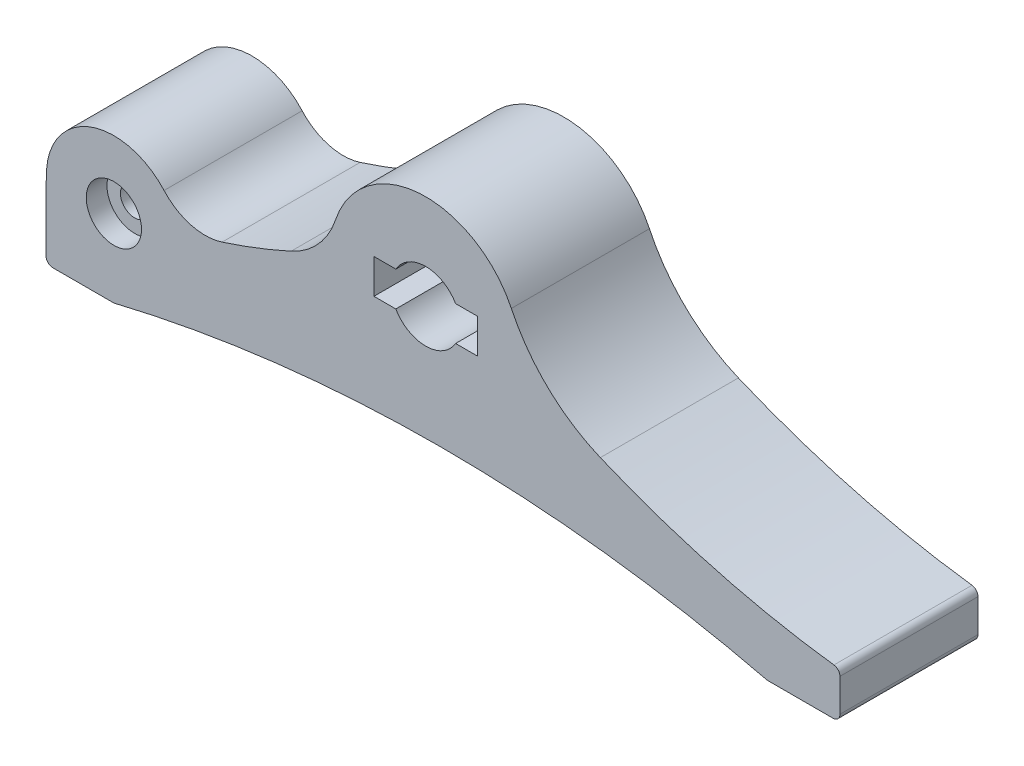
ISO-10303-21;
HEADER;
FILE_DESCRIPTION(('STEP AP214'),'2;1');
FILE_NAME('part.step','',(''),(''),'','','');
FILE_SCHEMA(('AUTOMOTIVE_DESIGN { 1 0 10303 214 1 1 1 1 }'));
ENDSEC;
DATA;
#1=APPLICATION_CONTEXT('core data for automotive mechanical design processes');
#2=APPLICATION_PROTOCOL_DEFINITION('international standard','automotive_design',2000,#1);
#3=PRODUCT_CONTEXT('',#1,'mechanical');
#4=PRODUCT('Part','Part','',(#3));
#5=PRODUCT_RELATED_PRODUCT_CATEGORY('part','',(#4));
#6=PRODUCT_DEFINITION_FORMATION('','',#4);
#7=PRODUCT_DEFINITION_CONTEXT('part definition',#1,'design');
#8=PRODUCT_DEFINITION('design','',#6,#7);
#9=PRODUCT_DEFINITION_SHAPE('','',#8);
#10=(LENGTH_UNIT() NAMED_UNIT(*) SI_UNIT(.MILLI.,.METRE.));
#11=(NAMED_UNIT(*) PLANE_ANGLE_UNIT() SI_UNIT($,.RADIAN.));
#12=(NAMED_UNIT(*) SI_UNIT($,.STERADIAN.) SOLID_ANGLE_UNIT());
#13=UNCERTAINTY_MEASURE_WITH_UNIT(LENGTH_MEASURE(1.E-05),#10,'distance_accuracy_value','');
#14=(GEOMETRIC_REPRESENTATION_CONTEXT(3) GLOBAL_UNCERTAINTY_ASSIGNED_CONTEXT((#13)) GLOBAL_UNIT_ASSIGNED_CONTEXT((#10,
#11,#12)) REPRESENTATION_CONTEXT('',''));
#15=CARTESIAN_POINT('',(0.,0.,0.));
#16=DIRECTION('',(0.,0.,1.));
#17=DIRECTION('',(1.,0.,0.));
#18=AXIS2_PLACEMENT_3D('',#15,#16,#17);
#19=CARTESIAN_POINT('',(-45.1700457196241,-10.9429497954306,20.));
#20=DIRECTION('',(0.,0.,-1.));
#21=DIRECTION('',(-1.,0.,0.));
#22=AXIS2_PLACEMENT_3D('',#19,#20,#21);
#23=CYLINDRICAL_SURFACE('',#22,2.04999999999999);
#24=CARTESIAN_POINT('',(-45.1700457196241,-10.9429497954306,3.));
#25=DIRECTION('',(0.,0.,-1.));
#26=DIRECTION('',(-1.,0.,0.));
#27=AXIS2_PLACEMENT_3D('',#24,#25,#26);
#28=CIRCLE('',#27,2.04999999999999);
#29=CARTESIAN_POINT('',(-47.2200457196241,-10.9429497954306,3.));
#30=VERTEX_POINT('',#29);
#31=EDGE_CURVE('E272',#30,#30,#28,.T.);
#32=ORIENTED_EDGE('',*,*,#31,.T.);
#33=EDGE_LOOP('',(#32));
#34=FACE_BOUND('',#33,.T.);
#35=CARTESIAN_POINT('',(-45.1700457196241,-10.9429497954306,17.));
#36=DIRECTION('',(0.,0.,1.));
#37=DIRECTION('',(1.,0.,0.));
#38=AXIS2_PLACEMENT_3D('',#35,#36,#37);
#39=CIRCLE('',#38,2.04999999999999);
#40=CARTESIAN_POINT('',(-43.1200457196241,-10.9429497954306,17.));
#41=VERTEX_POINT('',#40);
#42=EDGE_CURVE('E42',#41,#41,#39,.T.);
#43=ORIENTED_EDGE('',*,*,#42,.T.);
#44=EDGE_LOOP('',(#43));
#45=FACE_BOUND('',#44,.T.);
#46=ADVANCED_FACE('F38',(#34,#45),#23,.F.);
#47=CARTESIAN_POINT('',(0.,0.,20.));
#48=DIRECTION('',(0.,0.,-1.));
#49=DIRECTION('',(-1.,0.,0.));
#50=AXIS2_PLACEMENT_3D('',#47,#48,#49);
#51=CYLINDRICAL_SURFACE('',#50,13.7521875573783);
#52=CARTESIAN_POINT('',(0.,0.,20.));
#53=DIRECTION('',(0.,0.,1.));
#54=DIRECTION('',(1.,0.,0.));
#55=AXIS2_PLACEMENT_3D('',#52,#53,#54);
#56=CIRCLE('',#55,13.7521875573783);
#57=CARTESIAN_POINT('',(12.4069676906403,5.93210041525924,20.));
#58=VERTEX_POINT('',#57);
#59=CARTESIAN_POINT('',(-13.0560873283206,4.31986646652155,20.));
#60=VERTEX_POINT('',#59);
#61=EDGE_CURVE('E244',#58,#60,#56,.T.);
#62=ORIENTED_EDGE('',*,*,#61,.F.);
#63=DIRECTION('',(0.,0.,-1.));
#64=VECTOR('',#63,1.);
#65=CARTESIAN_POINT('',(12.4069676906403,5.93210041525924,20.));
#66=LINE('',#65,#64);
#67=CARTESIAN_POINT('',(12.4069676906403,5.93210041525924,0.));
#68=VERTEX_POINT('',#67);
#69=EDGE_CURVE('E380',#58,#68,#66,.T.);
#70=ORIENTED_EDGE('',*,*,#69,.T.);
#71=CARTESIAN_POINT('',(0.,0.,0.));
#72=DIRECTION('',(0.,0.,1.));
#73=DIRECTION('',(1.,0.,0.));
#74=AXIS2_PLACEMENT_3D('',#71,#72,#73);
#75=CIRCLE('',#74,13.7521875573783);
#76=CARTESIAN_POINT('',(-13.0560873283206,4.31986646652155,0.));
#77=VERTEX_POINT('',#76);
#78=EDGE_CURVE('E288',#68,#77,#75,.T.);
#79=ORIENTED_EDGE('',*,*,#78,.T.);
#80=DIRECTION('',(0.,0.,-1.));
#81=VECTOR('',#80,1.);
#82=CARTESIAN_POINT('',(-13.0560873283206,4.31986646652155,20.));
#83=LINE('',#82,#81);
#84=EDGE_CURVE('E335',#77,#60,#83,.F.);
#85=ORIENTED_EDGE('',*,*,#84,.T.);
#86=EDGE_LOOP('',(#62,#70,#79,#85));
#87=FACE_BOUND('',#86,.T.);
#88=ADVANCED_FACE('F439',(#87),#51,.T.);
#89=CARTESIAN_POINT('',(-58.2787027432777,82.7966281239389,20.));
#90=DIRECTION('',(0.,0.,-1.));
#91=DIRECTION('',(-1.,0.,0.));
#92=AXIS2_PLACEMENT_3D('',#89,#90,#91);
#93=CYLINDRICAL_SURFACE('',#92,94.0100642659815);
#94=CARTESIAN_POINT('',(-58.2787027432777,82.7966281239389,0.));
#95=DIRECTION('',(0.,0.,1.));
#96=DIRECTION('',(1.,0.,0.));
#97=AXIS2_PLACEMENT_3D('',#94,#95,#96);
#98=CIRCLE('',#97,94.0100642659815);
#99=CARTESIAN_POINT('',(-19.4985505803734,-2.84210132434254,0.));
#100=VERTEX_POINT('',#99);
#101=CARTESIAN_POINT('',(-29.4918320171861,-6.69755189405587,0.));
#102=VERTEX_POINT('',#101);
#103=EDGE_CURVE('E290',#100,#102,#98,.F.);
#104=ORIENTED_EDGE('',*,*,#103,.T.);
#105=DIRECTION('',(0.,0.,-1.));
#106=VECTOR('',#105,1.);
#107=CARTESIAN_POINT('',(-29.4918320171861,-6.69755189405588,20.));
#108=LINE('',#107,#106);
#109=CARTESIAN_POINT('',(-29.4918320171861,-6.69755189405587,20.));
#110=VERTEX_POINT('',#109);
#111=EDGE_CURVE('E346',#102,#110,#108,.F.);
#112=ORIENTED_EDGE('',*,*,#111,.T.);
#113=CARTESIAN_POINT('',(-58.2787027432777,82.7966281239389,20.));
#114=DIRECTION('',(0.,0.,1.));
#115=DIRECTION('',(1.,0.,0.));
#116=AXIS2_PLACEMENT_3D('',#113,#114,#115);
#117=CIRCLE('',#116,94.0100642659815);
#118=CARTESIAN_POINT('',(-19.4985505803734,-2.84210132434254,20.));
#119=VERTEX_POINT('',#118);
#120=EDGE_CURVE('E246',#119,#110,#117,.F.);
#121=ORIENTED_EDGE('',*,*,#120,.F.);
#122=DIRECTION('',(0.,0.,-1.));
#123=VECTOR('',#122,1.);
#124=CARTESIAN_POINT('',(-19.4985505803734,-2.84210132434257,20.));
#125=LINE('',#124,#123);
#126=EDGE_CURVE('E320',#119,#100,#125,.T.);
#127=ORIENTED_EDGE('',*,*,#126,.T.);
#128=EDGE_LOOP('',(#104,#112,#121,#127));
#129=FACE_BOUND('',#128,.T.);
#130=ADVANCED_FACE('F444',(#129),#93,.F.);
#131=CARTESIAN_POINT('',(-45.1700457196241,-10.9429497954306,20.));
#132=DIRECTION('',(0.,0.,-1.));
#133=DIRECTION('',(-1.,0.,0.));
#134=AXIS2_PLACEMENT_3D('',#131,#132,#133);
#135=CYLINDRICAL_SURFACE('',#134,9.76738269673384);
#136=CARTESIAN_POINT('',(-45.1700457196241,-10.9429497954306,20.));
#137=DIRECTION('',(0.,0.,1.));
#138=DIRECTION('',(1.,0.,0.));
#139=AXIS2_PLACEMENT_3D('',#136,#137,#138);
#140=CIRCLE('',#139,9.76738269673384);
#141=CARTESIAN_POINT('',(-37.8978372739602,-4.42246292194724,20.));
#142=VERTEX_POINT('',#141);
#143=CARTESIAN_POINT('',(-54.9192478656385,-11.5386193855598,20.));
#144=VERTEX_POINT('',#143);
#145=EDGE_CURVE('E249',#142,#144,#140,.T.);
#146=ORIENTED_EDGE('',*,*,#145,.F.);
#147=DIRECTION('',(0.,0.,-1.));
#148=VECTOR('',#147,1.);
#149=CARTESIAN_POINT('',(-37.8978372739602,-4.42246292194724,20.));
#150=LINE('',#149,#148);
#151=CARTESIAN_POINT('',(-37.8978372739602,-4.42246292194724,0.));
#152=VERTEX_POINT('',#151);
#153=EDGE_CURVE('E343',#142,#152,#150,.T.);
#154=ORIENTED_EDGE('',*,*,#153,.T.);
#155=CARTESIAN_POINT('',(-45.1700457196241,-10.9429497954306,0.));
#156=DIRECTION('',(0.,0.,1.));
#157=DIRECTION('',(1.,0.,0.));
#158=AXIS2_PLACEMENT_3D('',#155,#156,#157);
#159=CIRCLE('',#158,9.76738269673384);
#160=CARTESIAN_POINT('',(-54.9192478656385,-11.5386193855598,0.));
#161=VERTEX_POINT('',#160);
#162=EDGE_CURVE('E293',#152,#161,#159,.T.);
#163=ORIENTED_EDGE('',*,*,#162,.T.);
#164=DIRECTION('',(0.,0.,-1.));
#165=VECTOR('',#164,1.);
#166=CARTESIAN_POINT('',(-54.9192478656385,-11.5386193855598,20.));
#167=LINE('',#166,#165);
#168=EDGE_CURVE('E317',#144,#161,#167,.T.);
#169=ORIENTED_EDGE('',*,*,#168,.F.);
#170=EDGE_LOOP('',(#146,#154,#163,#169));
#171=FACE_BOUND('',#170,.T.);
#172=ADVANCED_FACE('F539',(#171),#135,.T.);
#173=CARTESIAN_POINT('',(-48.7328645332048,12.5272778366249,20.));
#174=DIRECTION('',(-0.968512248283623,0.248965911169788,0.));
#175=DIRECTION('',(-0.248965911169788,-0.968512248283623,0.));
#176=AXIS2_PLACEMENT_3D('',#173,#174,#175);
#177=PLANE('',#176);
#178=DIRECTION('',(0.248965911169788,0.968512248283623,0.));
#179=VECTOR('',#178,1.);
#180=CARTESIAN_POINT('',(-48.7328645332048,12.5272778366249,0.));
#181=LINE('',#180,#179);
#182=CARTESIAN_POINT('',(-55.,-11.8527564930726,0.));
#183=VERTEX_POINT('',#182);
#184=EDGE_CURVE('E295',#183,#161,#181,.T.);
#185=ORIENTED_EDGE('',*,*,#184,.F.);
#186=DIRECTION('',(0.,0.,-1.));
#187=VECTOR('',#186,1.);
#188=CARTESIAN_POINT('',(-55.,-11.8527564930726,20.));
#189=LINE('',#188,#187);
#190=CARTESIAN_POINT('',(-55.,-11.8527564930726,20.));
#191=VERTEX_POINT('',#190);
#192=EDGE_CURVE('E315',#191,#183,#189,.T.);
#193=ORIENTED_EDGE('',*,*,#192,.F.);
#194=DIRECTION('',(0.248965911169788,0.968512248283623,0.));
#195=VECTOR('',#194,1.);
#196=CARTESIAN_POINT('',(-48.7328645332048,12.5272778366249,20.));
#197=LINE('',#196,#195);
#198=EDGE_CURVE('E251',#191,#144,#197,.T.);
#199=ORIENTED_EDGE('',*,*,#198,.T.);
#200=ORIENTED_EDGE('',*,*,#168,.T.);
#201=EDGE_LOOP('',(#185,#193,#199,#200));
#202=FACE_BOUND('',#201,.T.);
#203=ADVANCED_FACE('F535',(#202),#177,.T.);
#204=CARTESIAN_POINT('',(-55.,0.,20.));
#205=DIRECTION('',(1.,0.,0.));
#206=DIRECTION('',(0.,0.,-1.));
#207=AXIS2_PLACEMENT_3D('',#204,#205,#206);
#208=PLANE('',#207);
#209=DIRECTION('',(0.,-1.,0.));
#210=VECTOR('',#209,1.);
#211=CARTESIAN_POINT('',(-55.,0.,0.));
#212=LINE('',#211,#210);
#213=CARTESIAN_POINT('',(-55.,-21.1771156110586,0.));
#214=VERTEX_POINT('',#213);
#215=EDGE_CURVE('E298',#183,#214,#212,.T.);
#216=ORIENTED_EDGE('',*,*,#215,.T.);
#217=DIRECTION('',(0.,0.,-1.));
#218=VECTOR('',#217,1.);
#219=CARTESIAN_POINT('',(-55.,-21.1771156110586,20.));
#220=LINE('',#219,#218);
#221=CARTESIAN_POINT('',(-55.,-21.1771156110586,20.));
#222=VERTEX_POINT('',#221);
#223=EDGE_CURVE('E361',#214,#222,#220,.F.);
#224=ORIENTED_EDGE('',*,*,#223,.T.);
#225=DIRECTION('',(0.,-1.,0.));
#226=VECTOR('',#225,1.);
#227=CARTESIAN_POINT('',(-55.,0.,20.));
#228=LINE('',#227,#226);
#229=EDGE_CURVE('E254',#191,#222,#228,.T.);
#230=ORIENTED_EDGE('',*,*,#229,.F.);
#231=ORIENTED_EDGE('',*,*,#192,.T.);
#232=EDGE_LOOP('',(#216,#224,#230,#231));
#233=FACE_BOUND('',#232,.T.);
#234=ADVANCED_FACE('F529',(#233),#208,.F.);
#235=CARTESIAN_POINT('',(0.,-22.1771156110586,20.));
#236=DIRECTION('',(0.,1.,0.));
#237=DIRECTION('',(0.,0.,1.));
#238=AXIS2_PLACEMENT_3D('',#235,#236,#237);
#239=PLANE('',#238);
#240=DIRECTION('',(1.,0.,0.));
#241=VECTOR('',#240,1.);
#242=CARTESIAN_POINT('',(0.,-22.1771156110586,20.));
#243=LINE('',#242,#241);
#244=CARTESIAN_POINT('',(-54.,-22.1771156110586,20.));
#245=VERTEX_POINT('',#244);
#246=CARTESIAN_POINT('',(-45.1700457196241,-22.1771156110586,20.));
#247=VERTEX_POINT('',#246);
#248=EDGE_CURVE('E257',#245,#247,#243,.T.);
#249=ORIENTED_EDGE('',*,*,#248,.F.);
#250=DIRECTION('',(0.,0.,-1.));
#251=VECTOR('',#250,1.);
#252=CARTESIAN_POINT('',(-54.,-22.1771156110586,20.));
#253=LINE('',#252,#251);
#254=CARTESIAN_POINT('',(-54.,-22.1771156110586,0.));
#255=VERTEX_POINT('',#254);
#256=EDGE_CURVE('E352',#245,#255,#253,.T.);
#257=ORIENTED_EDGE('',*,*,#256,.T.);
#258=DIRECTION('',(1.,0.,0.));
#259=VECTOR('',#258,1.);
#260=CARTESIAN_POINT('',(0.,-22.1771156110586,0.));
#261=LINE('',#260,#259);
#262=CARTESIAN_POINT('',(-45.1700457196241,-22.1771156110586,0.));
#263=VERTEX_POINT('',#262);
#264=EDGE_CURVE('E301',#255,#263,#261,.T.);
#265=ORIENTED_EDGE('',*,*,#264,.T.);
#266=DIRECTION('',(0.,0.,-1.));
#267=VECTOR('',#266,1.);
#268=CARTESIAN_POINT('',(-45.1700457196241,-22.1771156110586,20.));
#269=LINE('',#268,#267);
#270=EDGE_CURVE('E312',#247,#263,#269,.T.);
#271=ORIENTED_EDGE('',*,*,#270,.F.);
#272=EDGE_LOOP('',(#249,#257,#265,#271));
#273=FACE_BOUND('',#272,.T.);
#274=ADVANCED_FACE('F523',(#273),#239,.F.);
#275=CARTESIAN_POINT('',(2.15574626319965,-218.383407220201,20.));
#276=DIRECTION('',(0.,0.,-1.));
#277=DIRECTION('',(-1.,0.,0.));
#278=AXIS2_PLACEMENT_3D('',#275,#276,#277);
#279=CYLINDRICAL_SURFACE('',#278,201.833197105465);
#280=CARTESIAN_POINT('',(2.15574626319965,-218.383407220201,0.));
#281=DIRECTION('',(0.,0.,1.));
#282=DIRECTION('',(1.,0.,0.));
#283=AXIS2_PLACEMENT_3D('',#280,#281,#282);
#284=CIRCLE('',#283,201.833197105465);
#285=CARTESIAN_POINT('',(49.4815382460234,-22.1771156110586,0.));
#286=VERTEX_POINT('',#285);
#287=EDGE_CURVE('E303',#263,#286,#284,.F.);
#288=ORIENTED_EDGE('',*,*,#287,.T.);
#289=DIRECTION('',(0.,0.,-1.));
#290=VECTOR('',#289,1.);
#291=CARTESIAN_POINT('',(49.4815382460234,-22.1771156110586,20.));
#292=LINE('',#291,#290);
#293=CARTESIAN_POINT('',(49.4815382460234,-22.1771156110586,20.));
#294=VERTEX_POINT('',#293);
#295=EDGE_CURVE('E208',#294,#286,#292,.T.);
#296=ORIENTED_EDGE('',*,*,#295,.F.);
#297=CARTESIAN_POINT('',(2.15574626319965,-218.383407220201,20.));
#298=DIRECTION('',(0.,0.,1.));
#299=DIRECTION('',(1.,0.,0.));
#300=AXIS2_PLACEMENT_3D('',#297,#298,#299);
#301=CIRCLE('',#300,201.833197105465);
#302=EDGE_CURVE('E259',#247,#294,#301,.F.);
#303=ORIENTED_EDGE('',*,*,#302,.F.);
#304=ORIENTED_EDGE('',*,*,#270,.T.);
#305=EDGE_LOOP('',(#288,#296,#303,#304));
#306=FACE_BOUND('',#305,.T.);
#307=ADVANCED_FACE('F518',(#306),#279,.F.);
#308=CARTESIAN_POINT('',(0.,-22.1771156110586,20.));
#309=DIRECTION('',(0.,1.,0.));
#310=DIRECTION('',(0.,0.,1.));
#311=AXIS2_PLACEMENT_3D('',#308,#309,#310);
#312=PLANE('',#311);
#313=DIRECTION('',(1.,0.,0.));
#314=VECTOR('',#313,1.);
#315=CARTESIAN_POINT('',(0.,-22.1771156110586,0.));
#316=LINE('',#315,#314);
#317=CARTESIAN_POINT('',(59.,-22.1771156110586,0.));
#318=VERTEX_POINT('',#317);
#319=EDGE_CURVE('E305',#286,#318,#316,.T.);
#320=ORIENTED_EDGE('',*,*,#319,.T.);
#321=DIRECTION('',(0.,0.,-1.));
#322=VECTOR('',#321,1.);
#323=CARTESIAN_POINT('',(59.,-22.1771156110586,20.));
#324=LINE('',#323,#322);
#325=CARTESIAN_POINT('',(59.,-22.1771156110586,20.));
#326=VERTEX_POINT('',#325);
#327=EDGE_CURVE('E375',#318,#326,#324,.F.);
#328=ORIENTED_EDGE('',*,*,#327,.T.);
#329=DIRECTION('',(1.,0.,0.));
#330=VECTOR('',#329,1.);
#331=CARTESIAN_POINT('',(0.,-22.1771156110586,20.));
#332=LINE('',#331,#330);
#333=EDGE_CURVE('E261',#294,#326,#332,.T.);
#334=ORIENTED_EDGE('',*,*,#333,.F.);
#335=ORIENTED_EDGE('',*,*,#295,.T.);
#336=EDGE_LOOP('',(#320,#328,#334,#335));
#337=FACE_BOUND('',#336,.T.);
#338=ADVANCED_FACE('F513',(#337),#312,.F.);
#339=CARTESIAN_POINT('',(60.,0.,20.));
#340=DIRECTION('',(1.,0.,0.));
#341=DIRECTION('',(0.,0.,-1.));
#342=AXIS2_PLACEMENT_3D('',#339,#340,#341);
#343=PLANE('',#342);
#344=DIRECTION('',(0.,-1.,0.));
#345=VECTOR('',#344,1.);
#346=CARTESIAN_POINT('',(60.,0.,20.));
#347=LINE('',#346,#345);
#348=CARTESIAN_POINT('',(60.,-16.4248098942037,20.));
#349=VERTEX_POINT('',#348);
#350=CARTESIAN_POINT('',(60.,-21.1771156110586,20.));
#351=VERTEX_POINT('',#350);
#352=EDGE_CURVE('E264',#349,#351,#347,.T.);
#353=ORIENTED_EDGE('',*,*,#352,.T.);
#354=DIRECTION('',(0.,0.,-1.));
#355=VECTOR('',#354,1.);
#356=CARTESIAN_POINT('',(60.,-21.1771156110586,0.));
#357=LINE('',#356,#355);
#358=CARTESIAN_POINT('',(60.,-21.1771156110586,0.));
#359=VERTEX_POINT('',#358);
#360=EDGE_CURVE('E372',#351,#359,#357,.T.);
#361=ORIENTED_EDGE('',*,*,#360,.T.);
#362=DIRECTION('',(0.,-1.,0.));
#363=VECTOR('',#362,1.);
#364=CARTESIAN_POINT('',(60.,0.,0.));
#365=LINE('',#364,#363);
#366=CARTESIAN_POINT('',(60.,-16.4248098942037,0.));
#367=VERTEX_POINT('',#366);
#368=EDGE_CURVE('E227',#367,#359,#365,.T.);
#369=ORIENTED_EDGE('',*,*,#368,.F.);
#370=DIRECTION('',(0.,0.,-1.));
#371=VECTOR('',#370,1.);
#372=CARTESIAN_POINT('',(60.,-16.4248098942037,20.));
#373=LINE('',#372,#371);
#374=EDGE_CURVE('E370',#367,#349,#373,.F.);
#375=ORIENTED_EDGE('',*,*,#374,.T.);
#376=EDGE_LOOP('',(#353,#361,#369,#375));
#377=FACE_BOUND('',#376,.T.);
#378=ADVANCED_FACE('F506',(#377),#343,.T.);
#379=CARTESIAN_POINT('',(75.8234290260513,114.169235788753,20.));
#380=DIRECTION('',(0.,0.,-1.));
#381=DIRECTION('',(-1.,0.,0.));
#382=AXIS2_PLACEMENT_3D('',#379,#380,#381);
#383=CYLINDRICAL_SURFACE('',#382,130.673203545887);
#384=CARTESIAN_POINT('',(75.8234290260513,114.169235788753,0.));
#385=DIRECTION('',(0.,0.,1.));
#386=DIRECTION('',(1.,0.,0.));
#387=AXIS2_PLACEMENT_3D('',#384,#385,#386);
#388=CIRCLE('',#387,130.673203545887);
#389=CARTESIAN_POINT('',(25.2944522399454,-6.33930594125944,0.));
#390=VERTEX_POINT('',#389);
#391=CARTESIAN_POINT('',(59.1277665354302,-15.4330056229767,0.));
#392=VERTEX_POINT('',#391);
#393=EDGE_CURVE('E225',#390,#392,#388,.T.);
#394=ORIENTED_EDGE('',*,*,#393,.F.);
#395=DIRECTION('',(0.,0.,-1.));
#396=VECTOR('',#395,1.);
#397=CARTESIAN_POINT('',(25.2944522399454,-6.33930594125944,20.));
#398=LINE('',#397,#396);
#399=CARTESIAN_POINT('',(25.2944522399454,-6.33930594125944,20.));
#400=VERTEX_POINT('',#399);
#401=EDGE_CURVE('E61',#390,#400,#398,.F.);
#402=ORIENTED_EDGE('',*,*,#401,.T.);
#403=CARTESIAN_POINT('',(75.8234290260513,114.169235788753,20.));
#404=DIRECTION('',(0.,0.,1.));
#405=DIRECTION('',(1.,0.,0.));
#406=AXIS2_PLACEMENT_3D('',#403,#404,#405);
#407=CIRCLE('',#406,130.673203545887);
#408=CARTESIAN_POINT('',(59.1277665354302,-15.4330056229767,20.));
#409=VERTEX_POINT('',#408);
#410=EDGE_CURVE('E267',#400,#409,#407,.T.);
#411=ORIENTED_EDGE('',*,*,#410,.T.);
#412=DIRECTION('',(0.,0.,-1.));
#413=VECTOR('',#412,1.);
#414=CARTESIAN_POINT('',(59.1277665354302,-15.4330056229767,20.));
#415=LINE('',#414,#413);
#416=EDGE_CURVE('E377',#409,#392,#415,.T.);
#417=ORIENTED_EDGE('',*,*,#416,.T.);
#418=EDGE_LOOP('',(#394,#402,#411,#417));
#419=FACE_BOUND('',#418,.T.);
#420=ADVANCED_FACE('F472',(#419),#383,.F.);
#421=CARTESIAN_POINT('',(0.,0.,20.));
#422=DIRECTION('',(0.,0.,-1.));
#423=DIRECTION('',(-1.,0.,0.));
#424=AXIS2_PLACEMENT_3D('',#421,#422,#423);
#425=CYLINDRICAL_SURFACE('',#424,5.);
#426=CARTESIAN_POINT('',(0.,0.,0.));
#427=DIRECTION('',(0.,0.,1.));
#428=DIRECTION('',(1.,0.,0.));
#429=AXIS2_PLACEMENT_3D('',#426,#427,#428);
#430=CIRCLE('',#429,5.);
#431=CARTESIAN_POINT('',(4.33012701892219,2.5,0.));
#432=VERTEX_POINT('',#431);
#433=CARTESIAN_POINT('',(-4.33012701892219,2.5,0.));
#434=VERTEX_POINT('',#433);
#435=EDGE_CURVE('E205',#432,#434,#430,.T.);
#436=ORIENTED_EDGE('',*,*,#435,.F.);
#437=DIRECTION('',(0.,0.,-1.));
#438=VECTOR('',#437,1.);
#439=CARTESIAN_POINT('',(4.33012701892219,2.5,20.));
#440=LINE('',#439,#438);
#441=CARTESIAN_POINT('',(4.33012701892219,2.5,20.));
#442=VERTEX_POINT('',#441);
#443=EDGE_CURVE('E199',#442,#432,#440,.T.);
#444=ORIENTED_EDGE('',*,*,#443,.F.);
#445=CARTESIAN_POINT('',(0.,0.,20.));
#446=DIRECTION('',(0.,0.,1.));
#447=DIRECTION('',(1.,0.,0.));
#448=AXIS2_PLACEMENT_3D('',#445,#446,#447);
#449=CIRCLE('',#448,5.);
#450=CARTESIAN_POINT('',(-4.33012701892219,2.5,20.));
#451=VERTEX_POINT('',#450);
#452=EDGE_CURVE('E203',#442,#451,#449,.T.);
#453=ORIENTED_EDGE('',*,*,#452,.T.);
#454=DIRECTION('',(0.,0.,-1.));
#455=VECTOR('',#454,1.);
#456=CARTESIAN_POINT('',(-4.33012701892219,2.5,20.));
#457=LINE('',#456,#455);
#458=EDGE_CURVE('E269',#451,#434,#457,.T.);
#459=ORIENTED_EDGE('',*,*,#458,.T.);
#460=EDGE_LOOP('',(#436,#444,#453,#459));
#461=FACE_BOUND('',#460,.T.);
#462=ADVANCED_FACE('F201',(#461),#425,.F.);
#463=CARTESIAN_POINT('',(0.,2.5,20.));
#464=DIRECTION('',(0.,1.,0.));
#465=DIRECTION('',(0.,0.,1.));
#466=AXIS2_PLACEMENT_3D('',#463,#464,#465);
#467=PLANE('',#466);
#468=DIRECTION('',(1.,0.,0.));
#469=VECTOR('',#468,1.);
#470=CARTESIAN_POINT('',(0.,2.5,0.));
#471=LINE('',#470,#469);
#472=CARTESIAN_POINT('',(7.5,2.5,0.));
#473=VERTEX_POINT('',#472);
#474=EDGE_CURVE('E271',#432,#473,#471,.T.);
#475=ORIENTED_EDGE('',*,*,#474,.T.);
#476=DIRECTION('',(0.,0.,-1.));
#477=VECTOR('',#476,1.);
#478=CARTESIAN_POINT('',(7.5,2.5,20.));
#479=LINE('',#478,#477);
#480=CARTESIAN_POINT('',(7.5,2.5,20.));
#481=VERTEX_POINT('',#480);
#482=EDGE_CURVE('E209',#481,#473,#479,.T.);
#483=ORIENTED_EDGE('',*,*,#482,.F.);
#484=DIRECTION('',(1.,0.,0.));
#485=VECTOR('',#484,1.);
#486=CARTESIAN_POINT('',(0.,2.5,20.));
#487=LINE('',#486,#485);
#488=EDGE_CURVE('E212',#442,#481,#487,.T.);
#489=ORIENTED_EDGE('',*,*,#488,.F.);
#490=ORIENTED_EDGE('',*,*,#443,.T.);
#491=EDGE_LOOP('',(#475,#483,#489,#490));
#492=FACE_BOUND('',#491,.T.);
#493=ADVANCED_FACE('F213',(#492),#467,.F.);
#494=CARTESIAN_POINT('',(7.5,0.,20.));
#495=DIRECTION('',(1.,0.,0.));
#496=DIRECTION('',(0.,0.,-1.));
#497=AXIS2_PLACEMENT_3D('',#494,#495,#496);
#498=PLANE('',#497);
#499=DIRECTION('',(0.,-1.,0.));
#500=VECTOR('',#499,1.);
#501=CARTESIAN_POINT('',(7.5,0.,0.));
#502=LINE('',#501,#500);
#503=CARTESIAN_POINT('',(7.5,-2.5,0.));
#504=VERTEX_POINT('',#503);
#505=EDGE_CURVE('E274',#473,#504,#502,.T.);
#506=ORIENTED_EDGE('',*,*,#505,.T.);
#507=DIRECTION('',(0.,0.,-1.));
#508=VECTOR('',#507,1.);
#509=CARTESIAN_POINT('',(7.5,-2.5,20.));
#510=LINE('',#509,#508);
#511=CARTESIAN_POINT('',(7.5,-2.5,20.));
#512=VERTEX_POINT('',#511);
#513=EDGE_CURVE('E330',#512,#504,#510,.T.);
#514=ORIENTED_EDGE('',*,*,#513,.F.);
#515=DIRECTION('',(0.,-1.,0.));
#516=VECTOR('',#515,1.);
#517=CARTESIAN_POINT('',(7.5,0.,20.));
#518=LINE('',#517,#516);
#519=EDGE_CURVE('E217',#481,#512,#518,.T.);
#520=ORIENTED_EDGE('',*,*,#519,.F.);
#521=ORIENTED_EDGE('',*,*,#482,.T.);
#522=EDGE_LOOP('',(#506,#514,#520,#521));
#523=FACE_BOUND('',#522,.T.);
#524=ADVANCED_FACE('F466',(#523),#498,.F.);
#525=CARTESIAN_POINT('',(0.,-2.5,20.));
#526=DIRECTION('',(0.,1.,0.));
#527=DIRECTION('',(0.,0.,1.));
#528=AXIS2_PLACEMENT_3D('',#525,#526,#527);
#529=PLANE('',#528);
#530=DIRECTION('',(1.,0.,0.));
#531=VECTOR('',#530,1.);
#532=CARTESIAN_POINT('',(0.,-2.5,0.));
#533=LINE('',#532,#531);
#534=CARTESIAN_POINT('',(4.33012701892219,-2.5,0.));
#535=VERTEX_POINT('',#534);
#536=EDGE_CURVE('E278',#535,#504,#533,.T.);
#537=ORIENTED_EDGE('',*,*,#536,.F.);
#538=DIRECTION('',(0.,0.,-1.));
#539=VECTOR('',#538,1.);
#540=CARTESIAN_POINT('',(4.33012701892219,-2.5,20.));
#541=LINE('',#540,#539);
#542=CARTESIAN_POINT('',(4.33012701892219,-2.5,20.));
#543=VERTEX_POINT('',#542);
#544=EDGE_CURVE('E328',#543,#535,#541,.T.);
#545=ORIENTED_EDGE('',*,*,#544,.F.);
#546=DIRECTION('',(1.,0.,0.));
#547=VECTOR('',#546,1.);
#548=CARTESIAN_POINT('',(0.,-2.5,20.));
#549=LINE('',#548,#547);
#550=EDGE_CURVE('E234',#543,#512,#549,.T.);
#551=ORIENTED_EDGE('',*,*,#550,.T.);
#552=ORIENTED_EDGE('',*,*,#513,.T.);
#553=EDGE_LOOP('',(#537,#545,#551,#552));
#554=FACE_BOUND('',#553,.T.);
#555=ADVANCED_FACE('F462',(#554),#529,.T.);
#556=CARTESIAN_POINT('',(0.,0.,20.));
#557=DIRECTION('',(0.,0.,-1.));
#558=DIRECTION('',(-1.,0.,0.));
#559=AXIS2_PLACEMENT_3D('',#556,#557,#558);
#560=CYLINDRICAL_SURFACE('',#559,5.);
#561=CARTESIAN_POINT('',(0.,0.,0.));
#562=DIRECTION('',(0.,0.,1.));
#563=DIRECTION('',(1.,0.,0.));
#564=AXIS2_PLACEMENT_3D('',#561,#562,#563);
#565=CIRCLE('',#564,5.);
#566=CARTESIAN_POINT('',(-4.33012701892219,-2.5,0.));
#567=VERTEX_POINT('',#566);
#568=EDGE_CURVE('E281',#567,#535,#565,.T.);
#569=ORIENTED_EDGE('',*,*,#568,.F.);
#570=DIRECTION('',(0.,0.,-1.));
#571=VECTOR('',#570,1.);
#572=CARTESIAN_POINT('',(-4.33012701892219,-2.5,20.));
#573=LINE('',#572,#571);
#574=CARTESIAN_POINT('',(-4.33012701892219,-2.5,20.));
#575=VERTEX_POINT('',#574);
#576=EDGE_CURVE('E326',#575,#567,#573,.T.);
#577=ORIENTED_EDGE('',*,*,#576,.F.);
#578=CARTESIAN_POINT('',(0.,0.,20.));
#579=DIRECTION('',(0.,0.,1.));
#580=DIRECTION('',(1.,0.,0.));
#581=AXIS2_PLACEMENT_3D('',#578,#579,#580);
#582=CIRCLE('',#581,5.);
#583=EDGE_CURVE('E237',#575,#543,#582,.T.);
#584=ORIENTED_EDGE('',*,*,#583,.T.);
#585=ORIENTED_EDGE('',*,*,#544,.T.);
#586=EDGE_LOOP('',(#569,#577,#584,#585));
#587=FACE_BOUND('',#586,.T.);
#588=ADVANCED_FACE('F460',(#587),#560,.F.);
#589=CARTESIAN_POINT('',(-7.5,-2.5,0.));
#590=VERTEX_POINT('',#589);
#591=EDGE_CURVE('E282',#590,#567,#533,.T.);
#592=ORIENTED_EDGE('',*,*,#591,.F.);
#593=DIRECTION('',(0.,0.,-1.));
#594=VECTOR('',#593,1.);
#595=CARTESIAN_POINT('',(-7.5,-2.5,20.));
#596=LINE('',#595,#594);
#597=CARTESIAN_POINT('',(-7.5,-2.5,20.));
#598=VERTEX_POINT('',#597);
#599=EDGE_CURVE('E324',#598,#590,#596,.T.);
#600=ORIENTED_EDGE('',*,*,#599,.F.);
#601=EDGE_CURVE('E238',#598,#575,#549,.T.);
#602=ORIENTED_EDGE('',*,*,#601,.T.);
#603=ORIENTED_EDGE('',*,*,#576,.T.);
#604=EDGE_LOOP('',(#592,#600,#602,#603));
#605=FACE_BOUND('',#604,.T.);
#606=ADVANCED_FACE('F456',(#605),#529,.T.);
#607=CARTESIAN_POINT('',(-7.5,0.,20.));
#608=DIRECTION('',(1.,0.,0.));
#609=DIRECTION('',(0.,0.,-1.));
#610=AXIS2_PLACEMENT_3D('',#607,#608,#609);
#611=PLANE('',#610);
#612=DIRECTION('',(0.,-1.,0.));
#613=VECTOR('',#612,1.);
#614=CARTESIAN_POINT('',(-7.5,0.,0.));
#615=LINE('',#614,#613);
#616=CARTESIAN_POINT('',(-7.5,2.5,0.));
#617=VERTEX_POINT('',#616);
#618=EDGE_CURVE('E285',#617,#590,#615,.T.);
#619=ORIENTED_EDGE('',*,*,#618,.F.);
#620=DIRECTION('',(0.,0.,-1.));
#621=VECTOR('',#620,1.);
#622=CARTESIAN_POINT('',(-7.5,2.5,20.));
#623=LINE('',#622,#621);
#624=CARTESIAN_POINT('',(-7.5,2.5,20.));
#625=VERTEX_POINT('',#624);
#626=EDGE_CURVE('E322',#625,#617,#623,.T.);
#627=ORIENTED_EDGE('',*,*,#626,.F.);
#628=DIRECTION('',(0.,-1.,0.));
#629=VECTOR('',#628,1.);
#630=CARTESIAN_POINT('',(-7.5,0.,20.));
#631=LINE('',#630,#629);
#632=EDGE_CURVE('E241',#625,#598,#631,.T.);
#633=ORIENTED_EDGE('',*,*,#632,.T.);
#634=ORIENTED_EDGE('',*,*,#599,.T.);
#635=EDGE_LOOP('',(#619,#627,#633,#634));
#636=FACE_BOUND('',#635,.T.);
#637=ADVANCED_FACE('F452',(#636),#611,.T.);
#638=EDGE_CURVE('E275',#617,#434,#471,.T.);
#639=ORIENTED_EDGE('',*,*,#638,.T.);
#640=ORIENTED_EDGE('',*,*,#458,.F.);
#641=EDGE_CURVE('E219',#625,#451,#487,.T.);
#642=ORIENTED_EDGE('',*,*,#641,.F.);
#643=ORIENTED_EDGE('',*,*,#626,.T.);
#644=EDGE_LOOP('',(#639,#640,#642,#643));
#645=FACE_BOUND('',#644,.T.);
#646=ADVANCED_FACE('F449',(#645),#467,.F.);
#647=CARTESIAN_POINT('',(0.,0.,20.));
#648=DIRECTION('',(0.,0.,1.));
#649=DIRECTION('',(1.,0.,0.));
#650=AXIS2_PLACEMENT_3D('',#647,#648,#649);
#651=PLANE('',#650);
#652=CARTESIAN_POINT('',(-45.1700457196241,-10.9429497954306,20.));
#653=DIRECTION('',(0.,0.,1.));
#654=DIRECTION('',(1.,0.,0.));
#655=AXIS2_PLACEMENT_3D('',#652,#653,#654);
#656=CIRCLE('',#655,4.00000000000001);
#657=CARTESIAN_POINT('',(-41.1700457196241,-10.9429497954306,20.));
#658=VERTEX_POINT('',#657);
#659=EDGE_CURVE('E417',#658,#658,#656,.T.);
#660=ORIENTED_EDGE('',*,*,#659,.F.);
#661=EDGE_LOOP('',(#660));
#662=FACE_BOUND('',#661,.T.);
#663=ORIENTED_EDGE('',*,*,#452,.F.);
#664=ORIENTED_EDGE('',*,*,#488,.T.);
#665=ORIENTED_EDGE('',*,*,#519,.T.);
#666=ORIENTED_EDGE('',*,*,#550,.F.);
#667=ORIENTED_EDGE('',*,*,#583,.F.);
#668=ORIENTED_EDGE('',*,*,#601,.F.);
#669=ORIENTED_EDGE('',*,*,#632,.F.);
#670=ORIENTED_EDGE('',*,*,#641,.T.);
#671=EDGE_LOOP('',(#663,#664,#665,#666,#667,#668,#669,#670));
#672=FACE_BOUND('',#671,.T.);
#673=ORIENTED_EDGE('',*,*,#229,.T.);
#674=CARTESIAN_POINT('',(-54.,-21.1771156110586,20.));
#675=DIRECTION('',(0.,0.,1.));
#676=DIRECTION('',(1.,0.,0.));
#677=AXIS2_PLACEMENT_3D('',#674,#675,#676);
#678=CIRCLE('',#677,1.);
#679=EDGE_CURVE('E368',#222,#245,#678,.T.);
#680=ORIENTED_EDGE('',*,*,#679,.T.);
#681=ORIENTED_EDGE('',*,*,#248,.T.);
#682=ORIENTED_EDGE('',*,*,#302,.T.);
#683=ORIENTED_EDGE('',*,*,#333,.T.);
#684=CARTESIAN_POINT('',(59.,-21.1771156110586,20.));
#685=DIRECTION('',(0.,0.,1.));
#686=DIRECTION('',(1.,0.,0.));
#687=AXIS2_PLACEMENT_3D('',#684,#685,#686);
#688=CIRCLE('',#687,1.);
#689=EDGE_CURVE('E366',#326,#351,#688,.T.);
#690=ORIENTED_EDGE('',*,*,#689,.T.);
#691=ORIENTED_EDGE('',*,*,#352,.F.);
#692=CARTESIAN_POINT('',(59.,-16.4248098942037,20.));
#693=DIRECTION('',(0.,0.,1.));
#694=DIRECTION('',(1.,0.,0.));
#695=AXIS2_PLACEMENT_3D('',#692,#693,#694);
#696=CIRCLE('',#695,1.);
#697=EDGE_CURVE('E363',#349,#409,#696,.T.);
#698=ORIENTED_EDGE('',*,*,#697,.T.);
#699=ORIENTED_EDGE('',*,*,#410,.F.);
#700=CARTESIAN_POINT('',(34.9615024489735,16.7160218650444,20.));
#701=DIRECTION('',(0.,0.,1.));
#702=DIRECTION('',(1.,0.,0.));
#703=AXIS2_PLACEMENT_3D('',#700,#701,#702);
#704=CIRCLE('',#703,25.);
#705=EDGE_CURVE('E11',#400,#58,#704,.F.);
#706=ORIENTED_EDGE('',*,*,#705,.T.);
#707=ORIENTED_EDGE('',*,*,#61,.T.);
#708=CARTESIAN_POINT('',(-24.4486783096579,8.0893320429597,20.));
#709=DIRECTION('',(0.,0.,1.));
#710=DIRECTION('',(1.,0.,0.));
#711=AXIS2_PLACEMENT_3D('',#708,#709,#710);
#712=CIRCLE('',#711,12.);
#713=EDGE_CURVE('E341',#60,#119,#712,.F.);
#714=ORIENTED_EDGE('',*,*,#713,.T.);
#715=ORIENTED_EDGE('',*,*,#120,.T.);
#716=CARTESIAN_POINT('',(-31.9415161824598,0.918158676232853,20.));
#717=DIRECTION('',(0.,0.,1.));
#718=DIRECTION('',(1.,0.,0.));
#719=AXIS2_PLACEMENT_3D('',#716,#717,#718);
#720=CIRCLE('',#719,8.);
#721=EDGE_CURVE('E350',#110,#142,#720,.F.);
#722=ORIENTED_EDGE('',*,*,#721,.T.);
#723=ORIENTED_EDGE('',*,*,#145,.T.);
#724=ORIENTED_EDGE('',*,*,#198,.F.);
#725=EDGE_LOOP('',(#673,#680,#681,#682,#683,#690,#691,#698,#699,#706,#707,#714,#715,#722,#723,#724));
#726=FACE_BOUND('',#725,.T.);
#727=ADVANCED_FACE('F220',(#662,#672,#726),#651,.T.);
#728=CARTESIAN_POINT('',(0.,0.,0.));
#729=DIRECTION('',(0.,0.,1.));
#730=DIRECTION('',(1.,0.,0.));
#731=AXIS2_PLACEMENT_3D('',#728,#729,#730);
#732=PLANE('',#731);
#733=CARTESIAN_POINT('',(-49.3345282073598,-19.024990649179,0.));
#734=DIRECTION('',(0.,0.,1.));
#735=DIRECTION('',(1.,0.,0.));
#736=AXIS2_PLACEMENT_3D('',#733,#734,#735);
#737=CIRCLE('',#736,1.25);
#738=CARTESIAN_POINT('',(-48.0845282073598,-19.024990649179,0.));
#739=VERTEX_POINT('',#738);
#740=EDGE_CURVE('E407',#739,#739,#737,.T.);
#741=ORIENTED_EDGE('',*,*,#740,.T.);
#742=EDGE_LOOP('',(#741));
#743=FACE_BOUND('',#742,.T.);
#744=CARTESIAN_POINT('',(34.7342932068225,-16.4202291493504,0.));
#745=DIRECTION('',(0.,0.,1.));
#746=DIRECTION('',(1.,0.,0.));
#747=AXIS2_PLACEMENT_3D('',#744,#745,#746);
#748=CIRCLE('',#747,1.25);
#749=CARTESIAN_POINT('',(35.9842932068225,-16.4202291493504,0.));
#750=VERTEX_POINT('',#749);
#751=EDGE_CURVE('E408',#750,#750,#748,.T.);
#752=ORIENTED_EDGE('',*,*,#751,.T.);
#753=EDGE_LOOP('',(#752));
#754=FACE_BOUND('',#753,.T.);
#755=CARTESIAN_POINT('',(-28.0758365845939,-16.4202291493504,0.));
#756=DIRECTION('',(0.,0.,1.));
#757=DIRECTION('',(1.,0.,0.));
#758=AXIS2_PLACEMENT_3D('',#755,#756,#757);
#759=CIRCLE('',#758,1.25);
#760=CARTESIAN_POINT('',(-26.8258365845939,-16.4202291493504,0.));
#761=VERTEX_POINT('',#760);
#762=EDGE_CURVE('E394',#761,#761,#759,.T.);
#763=ORIENTED_EDGE('',*,*,#762,.T.);
#764=EDGE_LOOP('',(#763));
#765=FACE_BOUND('',#764,.T.);
#766=CARTESIAN_POINT('',(54.7876907271337,-19.024990649179,0.));
#767=DIRECTION('',(0.,0.,1.));
#768=DIRECTION('',(1.,0.,0.));
#769=AXIS2_PLACEMENT_3D('',#766,#767,#768);
#770=CIRCLE('',#769,1.25);
#771=CARTESIAN_POINT('',(56.0376907271337,-19.024990649179,0.));
#772=VERTEX_POINT('',#771);
#773=EDGE_CURVE('E401',#772,#772,#770,.T.);
#774=ORIENTED_EDGE('',*,*,#773,.T.);
#775=EDGE_LOOP('',(#774));
#776=FACE_BOUND('',#775,.T.);
#777=CARTESIAN_POINT('',(-45.1700457196241,-10.9429497954306,0.));
#778=DIRECTION('',(0.,0.,-1.));
#779=DIRECTION('',(-1.,0.,0.));
#780=AXIS2_PLACEMENT_3D('',#777,#778,#779);
#781=CIRCLE('',#780,4.00000000000001);
#782=CARTESIAN_POINT('',(-49.1700457196241,-10.9429497954306,0.));
#783=VERTEX_POINT('',#782);
#784=EDGE_CURVE('E230',#783,#783,#781,.T.);
#785=ORIENTED_EDGE('',*,*,#784,.F.);
#786=EDGE_LOOP('',(#785));
#787=FACE_BOUND('',#786,.T.);
#788=ORIENTED_EDGE('',*,*,#435,.T.);
#789=ORIENTED_EDGE('',*,*,#638,.F.);
#790=ORIENTED_EDGE('',*,*,#618,.T.);
#791=ORIENTED_EDGE('',*,*,#591,.T.);
#792=ORIENTED_EDGE('',*,*,#568,.T.);
#793=ORIENTED_EDGE('',*,*,#536,.T.);
#794=ORIENTED_EDGE('',*,*,#505,.F.);
#795=ORIENTED_EDGE('',*,*,#474,.F.);
#796=EDGE_LOOP('',(#788,#789,#790,#791,#792,#793,#794,#795));
#797=FACE_BOUND('',#796,.T.);
#798=ORIENTED_EDGE('',*,*,#264,.F.);
#799=CARTESIAN_POINT('',(-54.,-21.1771156110586,0.));
#800=DIRECTION('',(0.,0.,1.));
#801=DIRECTION('',(1.,0.,0.));
#802=AXIS2_PLACEMENT_3D('',#799,#800,#801);
#803=CIRCLE('',#802,1.);
#804=EDGE_CURVE('E359',#255,#214,#803,.F.);
#805=ORIENTED_EDGE('',*,*,#804,.T.);
#806=ORIENTED_EDGE('',*,*,#215,.F.);
#807=ORIENTED_EDGE('',*,*,#184,.T.);
#808=ORIENTED_EDGE('',*,*,#162,.F.);
#809=CARTESIAN_POINT('',(-31.9415161824598,0.918158676232853,0.));
#810=DIRECTION('',(0.,0.,1.));
#811=DIRECTION('',(1.,0.,0.));
#812=AXIS2_PLACEMENT_3D('',#809,#810,#811);
#813=CIRCLE('',#812,8.);
#814=EDGE_CURVE('E348',#152,#102,#813,.T.);
#815=ORIENTED_EDGE('',*,*,#814,.T.);
#816=ORIENTED_EDGE('',*,*,#103,.F.);
#817=CARTESIAN_POINT('',(-24.4486783096579,8.0893320429597,0.));
#818=DIRECTION('',(0.,0.,1.));
#819=DIRECTION('',(1.,0.,0.));
#820=AXIS2_PLACEMENT_3D('',#817,#818,#819);
#821=CIRCLE('',#820,12.);
#822=EDGE_CURVE('E338',#100,#77,#821,.T.);
#823=ORIENTED_EDGE('',*,*,#822,.T.);
#824=ORIENTED_EDGE('',*,*,#78,.F.);
#825=CARTESIAN_POINT('',(34.9615024489735,16.7160218650444,0.));
#826=DIRECTION('',(0.,0.,1.));
#827=DIRECTION('',(1.,0.,0.));
#828=AXIS2_PLACEMENT_3D('',#825,#826,#827);
#829=CIRCLE('',#828,25.);
#830=EDGE_CURVE('E47',#68,#390,#829,.T.);
#831=ORIENTED_EDGE('',*,*,#830,.T.);
#832=ORIENTED_EDGE('',*,*,#393,.T.);
#833=CARTESIAN_POINT('',(59.,-16.4248098942037,0.));
#834=DIRECTION('',(0.,0.,1.));
#835=DIRECTION('',(1.,0.,0.));
#836=AXIS2_PLACEMENT_3D('',#833,#834,#835);
#837=CIRCLE('',#836,1.);
#838=EDGE_CURVE('E355',#392,#367,#837,.F.);
#839=ORIENTED_EDGE('',*,*,#838,.T.);
#840=ORIENTED_EDGE('',*,*,#368,.T.);
#841=CARTESIAN_POINT('',(59.,-21.1771156110586,0.));
#842=DIRECTION('',(0.,0.,1.));
#843=DIRECTION('',(1.,0.,0.));
#844=AXIS2_PLACEMENT_3D('',#841,#842,#843);
#845=CIRCLE('',#844,1.);
#846=EDGE_CURVE('E357',#359,#318,#845,.F.);
#847=ORIENTED_EDGE('',*,*,#846,.T.);
#848=ORIENTED_EDGE('',*,*,#319,.F.);
#849=ORIENTED_EDGE('',*,*,#287,.F.);
#850=EDGE_LOOP('',(#798,#805,#806,#807,#808,#815,#816,#823,#824,#831,#832,#839,#840,#847,#848,#849));
#851=FACE_BOUND('',#850,.T.);
#852=ADVANCED_FACE('F477',(#743,#754,#765,#776,#787,#797,#851),#732,.F.);
#853=CARTESIAN_POINT('',(-24.4486783096579,8.0893320429597,20.));
#854=DIRECTION('',(0.,0.,-1.));
#855=DIRECTION('',(-1.,0.,0.));
#856=AXIS2_PLACEMENT_3D('',#853,#854,#855);
#857=CYLINDRICAL_SURFACE('',#856,12.);
#858=ORIENTED_EDGE('',*,*,#713,.F.);
#859=ORIENTED_EDGE('',*,*,#84,.F.);
#860=ORIENTED_EDGE('',*,*,#822,.F.);
#861=ORIENTED_EDGE('',*,*,#126,.F.);
#862=EDGE_LOOP('',(#858,#859,#860,#861));
#863=FACE_BOUND('',#862,.T.);
#864=ADVANCED_FACE('F473',(#863),#857,.F.);
#865=CARTESIAN_POINT('',(-31.9415161824598,0.918158676232853,20.));
#866=DIRECTION('',(0.,0.,-1.));
#867=DIRECTION('',(-1.,0.,0.));
#868=AXIS2_PLACEMENT_3D('',#865,#866,#867);
#869=CYLINDRICAL_SURFACE('',#868,8.);
#870=ORIENTED_EDGE('',*,*,#721,.F.);
#871=ORIENTED_EDGE('',*,*,#111,.F.);
#872=ORIENTED_EDGE('',*,*,#814,.F.);
#873=ORIENTED_EDGE('',*,*,#153,.F.);
#874=EDGE_LOOP('',(#870,#871,#872,#873));
#875=FACE_BOUND('',#874,.T.);
#876=ADVANCED_FACE('F476',(#875),#869,.F.);
#877=CARTESIAN_POINT('',(-54.,-21.1771156110586,20.));
#878=DIRECTION('',(0.,0.,-1.));
#879=DIRECTION('',(-1.,0.,0.));
#880=AXIS2_PLACEMENT_3D('',#877,#878,#879);
#881=CYLINDRICAL_SURFACE('',#880,1.);
#882=ORIENTED_EDGE('',*,*,#679,.F.);
#883=ORIENTED_EDGE('',*,*,#223,.F.);
#884=ORIENTED_EDGE('',*,*,#804,.F.);
#885=ORIENTED_EDGE('',*,*,#256,.F.);
#886=EDGE_LOOP('',(#882,#883,#884,#885));
#887=FACE_BOUND('',#886,.T.);
#888=ADVANCED_FACE('F481',(#887),#881,.T.);
#889=CARTESIAN_POINT('',(59.,-21.1771156110586,20.));
#890=DIRECTION('',(0.,0.,1.));
#891=DIRECTION('',(1.,0.,0.));
#892=AXIS2_PLACEMENT_3D('',#889,#890,#891);
#893=CYLINDRICAL_SURFACE('',#892,1.);
#894=ORIENTED_EDGE('',*,*,#689,.F.);
#895=ORIENTED_EDGE('',*,*,#327,.F.);
#896=ORIENTED_EDGE('',*,*,#846,.F.);
#897=ORIENTED_EDGE('',*,*,#360,.F.);
#898=EDGE_LOOP('',(#894,#895,#896,#897));
#899=FACE_BOUND('',#898,.T.);
#900=ADVANCED_FACE('F485',(#899),#893,.T.);
#901=CARTESIAN_POINT('',(59.,-16.4248098942037,20.));
#902=DIRECTION('',(0.,0.,-1.));
#903=DIRECTION('',(-1.,0.,0.));
#904=AXIS2_PLACEMENT_3D('',#901,#902,#903);
#905=CYLINDRICAL_SURFACE('',#904,1.);
#906=ORIENTED_EDGE('',*,*,#697,.F.);
#907=ORIENTED_EDGE('',*,*,#374,.F.);
#908=ORIENTED_EDGE('',*,*,#838,.F.);
#909=ORIENTED_EDGE('',*,*,#416,.F.);
#910=EDGE_LOOP('',(#906,#907,#908,#909));
#911=FACE_BOUND('',#910,.T.);
#912=ADVANCED_FACE('F488',(#911),#905,.T.);
#913=CARTESIAN_POINT('',(34.9615024489735,16.7160218650444,20.));
#914=DIRECTION('',(0.,0.,-1.));
#915=DIRECTION('',(-1.,0.,0.));
#916=AXIS2_PLACEMENT_3D('',#913,#914,#915);
#917=CYLINDRICAL_SURFACE('',#916,25.);
#918=ORIENTED_EDGE('',*,*,#705,.F.);
#919=ORIENTED_EDGE('',*,*,#401,.F.);
#920=ORIENTED_EDGE('',*,*,#830,.F.);
#921=ORIENTED_EDGE('',*,*,#69,.F.);
#922=EDGE_LOOP('',(#918,#919,#920,#921));
#923=FACE_BOUND('',#922,.T.);
#924=ADVANCED_FACE('F40',(#923),#917,.F.);
#925=CARTESIAN_POINT('',(-45.1700457196241,-10.9429497954306,3.));
#926=DIRECTION('',(0.,0.,-1.));
#927=DIRECTION('',(-1.,0.,0.));
#928=AXIS2_PLACEMENT_3D('',#925,#926,#927);
#929=CYLINDRICAL_SURFACE('',#928,4.00000000000001);
#930=CARTESIAN_POINT('',(-45.1700457196241,-10.9429497954306,3.));
#931=DIRECTION('',(0.,0.,-1.));
#932=DIRECTION('',(-1.,0.,0.));
#933=AXIS2_PLACEMENT_3D('',#930,#931,#932);
#934=CIRCLE('',#933,4.00000000000001);
#935=CARTESIAN_POINT('',(-49.1700457196241,-10.9429497954306,3.));
#936=VERTEX_POINT('',#935);
#937=EDGE_CURVE('E385',#936,#936,#934,.T.);
#938=ORIENTED_EDGE('',*,*,#937,.F.);
#939=EDGE_LOOP('',(#938));
#940=FACE_BOUND('',#939,.T.);
#941=ORIENTED_EDGE('',*,*,#784,.T.);
#942=EDGE_LOOP('',(#941));
#943=FACE_BOUND('',#942,.T.);
#944=ADVANCED_FACE('F495',(#940,#943),#929,.F.);
#945=CARTESIAN_POINT('',(-45.1700457196241,-10.9429497954306,3.));
#946=DIRECTION('',(0.,0.,-1.));
#947=DIRECTION('',(-1.,0.,0.));
#948=AXIS2_PLACEMENT_3D('',#945,#946,#947);
#949=PLANE('',#948);
#950=ORIENTED_EDGE('',*,*,#31,.F.);
#951=EDGE_LOOP('',(#950));
#952=FACE_BOUND('',#951,.T.);
#953=ORIENTED_EDGE('',*,*,#937,.T.);
#954=EDGE_LOOP('',(#953));
#955=FACE_BOUND('',#954,.T.);
#956=ADVANCED_FACE('F578',(#952,#955),#949,.T.);
#957=CARTESIAN_POINT('',(54.7876907271337,-19.024990649179,10.));
#958=DIRECTION('',(0.,0.,-1.));
#959=DIRECTION('',(-1.,0.,0.));
#960=AXIS2_PLACEMENT_3D('',#957,#958,#959);
#961=CYLINDRICAL_SURFACE('',#960,1.25);
#962=CARTESIAN_POINT('',(54.7876907271337,-19.024990649179,10.));
#963=DIRECTION('',(0.,0.,1.));
#964=DIRECTION('',(1.,0.,0.));
#965=AXIS2_PLACEMENT_3D('',#962,#963,#964);
#966=CIRCLE('',#965,1.25);
#967=CARTESIAN_POINT('',(56.0376907271337,-19.024990649179,10.));
#968=VERTEX_POINT('',#967);
#969=EDGE_CURVE('E404',#968,#968,#966,.T.);
#970=ORIENTED_EDGE('',*,*,#969,.T.);
#971=EDGE_LOOP('',(#970));
#972=FACE_BOUND('',#971,.T.);
#973=ORIENTED_EDGE('',*,*,#773,.F.);
#974=EDGE_LOOP('',(#973));
#975=FACE_BOUND('',#974,.T.);
#976=ADVANCED_FACE('F582',(#972,#975),#961,.F.);
#977=CARTESIAN_POINT('',(54.7876907271337,-19.024990649179,10.));
#978=DIRECTION('',(0.,0.,1.));
#979=DIRECTION('',(1.,0.,0.));
#980=AXIS2_PLACEMENT_3D('',#977,#978,#979);
#981=PLANE('',#980);
#982=ORIENTED_EDGE('',*,*,#969,.F.);
#983=EDGE_LOOP('',(#982));
#984=FACE_BOUND('',#983,.T.);
#985=ADVANCED_FACE('F588',(#984),#981,.F.);
#986=CARTESIAN_POINT('',(-28.0758365845939,-16.4202291493504,10.));
#987=DIRECTION('',(0.,0.,-1.));
#988=DIRECTION('',(-1.,0.,0.));
#989=AXIS2_PLACEMENT_3D('',#986,#987,#988);
#990=CYLINDRICAL_SURFACE('',#989,1.25);
#991=CARTESIAN_POINT('',(-28.0758365845939,-16.4202291493504,10.));
#992=DIRECTION('',(0.,0.,1.));
#993=DIRECTION('',(1.,0.,0.));
#994=AXIS2_PLACEMENT_3D('',#991,#992,#993);
#995=CIRCLE('',#994,1.25);
#996=CARTESIAN_POINT('',(-26.8258365845939,-16.4202291493504,10.));
#997=VERTEX_POINT('',#996);
#998=EDGE_CURVE('E397',#997,#997,#995,.T.);
#999=ORIENTED_EDGE('',*,*,#998,.T.);
#1000=EDGE_LOOP('',(#999));
#1001=FACE_BOUND('',#1000,.T.);
#1002=ORIENTED_EDGE('',*,*,#762,.F.);
#1003=EDGE_LOOP('',(#1002));
#1004=FACE_BOUND('',#1003,.T.);
#1005=ADVANCED_FACE('F584',(#1001,#1004),#990,.F.);
#1006=CARTESIAN_POINT('',(-28.0758365845939,-16.4202291493504,10.));
#1007=DIRECTION('',(0.,0.,1.));
#1008=DIRECTION('',(1.,0.,0.));
#1009=AXIS2_PLACEMENT_3D('',#1006,#1007,#1008);
#1010=PLANE('',#1009);
#1011=ORIENTED_EDGE('',*,*,#998,.F.);
#1012=EDGE_LOOP('',(#1011));
#1013=FACE_BOUND('',#1012,.T.);
#1014=ADVANCED_FACE('F587',(#1013),#1010,.F.);
#1015=CARTESIAN_POINT('',(34.7342932068225,-16.4202291493504,10.));
#1016=DIRECTION('',(0.,0.,-1.));
#1017=DIRECTION('',(-1.,0.,0.));
#1018=AXIS2_PLACEMENT_3D('',#1015,#1016,#1017);
#1019=CYLINDRICAL_SURFACE('',#1018,1.25);
#1020=CARTESIAN_POINT('',(34.7342932068225,-16.4202291493504,10.));
#1021=DIRECTION('',(0.,0.,1.));
#1022=DIRECTION('',(1.,0.,0.));
#1023=AXIS2_PLACEMENT_3D('',#1020,#1021,#1022);
#1024=CIRCLE('',#1023,1.25);
#1025=CARTESIAN_POINT('',(35.9842932068225,-16.4202291493504,10.));
#1026=VERTEX_POINT('',#1025);
#1027=EDGE_CURVE('E398',#1026,#1026,#1024,.T.);
#1028=ORIENTED_EDGE('',*,*,#1027,.T.);
#1029=EDGE_LOOP('',(#1028));
#1030=FACE_BOUND('',#1029,.T.);
#1031=ORIENTED_EDGE('',*,*,#751,.F.);
#1032=EDGE_LOOP('',(#1031));
#1033=FACE_BOUND('',#1032,.T.);
#1034=ADVANCED_FACE('F592',(#1030,#1033),#1019,.F.);
#1035=CARTESIAN_POINT('',(34.7342932068225,-16.4202291493504,10.));
#1036=DIRECTION('',(0.,0.,1.));
#1037=DIRECTION('',(1.,0.,0.));
#1038=AXIS2_PLACEMENT_3D('',#1035,#1036,#1037);
#1039=PLANE('',#1038);
#1040=ORIENTED_EDGE('',*,*,#1027,.F.);
#1041=EDGE_LOOP('',(#1040));
#1042=FACE_BOUND('',#1041,.T.);
#1043=ADVANCED_FACE('F602',(#1042),#1039,.F.);
#1044=CARTESIAN_POINT('',(-49.3345282073598,-19.024990649179,10.));
#1045=DIRECTION('',(0.,0.,-1.));
#1046=DIRECTION('',(-1.,0.,0.));
#1047=AXIS2_PLACEMENT_3D('',#1044,#1045,#1046);
#1048=CYLINDRICAL_SURFACE('',#1047,1.25);
#1049=CARTESIAN_POINT('',(-49.3345282073598,-19.024990649179,10.));
#1050=DIRECTION('',(0.,0.,1.));
#1051=DIRECTION('',(1.,0.,0.));
#1052=AXIS2_PLACEMENT_3D('',#1049,#1050,#1051);
#1053=CIRCLE('',#1052,1.25);
#1054=CARTESIAN_POINT('',(-48.0845282073598,-19.024990649179,10.));
#1055=VERTEX_POINT('',#1054);
#1056=EDGE_CURVE('E392',#1055,#1055,#1053,.T.);
#1057=ORIENTED_EDGE('',*,*,#1056,.T.);
#1058=EDGE_LOOP('',(#1057));
#1059=FACE_BOUND('',#1058,.T.);
#1060=ORIENTED_EDGE('',*,*,#740,.F.);
#1061=EDGE_LOOP('',(#1060));
#1062=FACE_BOUND('',#1061,.T.);
#1063=ADVANCED_FACE('F606',(#1059,#1062),#1048,.F.);
#1064=CARTESIAN_POINT('',(-49.3345282073598,-19.024990649179,10.));
#1065=DIRECTION('',(0.,0.,1.));
#1066=DIRECTION('',(1.,0.,0.));
#1067=AXIS2_PLACEMENT_3D('',#1064,#1065,#1066);
#1068=PLANE('',#1067);
#1069=ORIENTED_EDGE('',*,*,#1056,.F.);
#1070=EDGE_LOOP('',(#1069));
#1071=FACE_BOUND('',#1070,.T.);
#1072=ADVANCED_FACE('F435',(#1071),#1068,.F.);
#1073=CARTESIAN_POINT('',(-45.1700457196241,-10.9429497954306,17.));
#1074=DIRECTION('',(0.,0.,1.));
#1075=DIRECTION('',(1.,0.,0.));
#1076=AXIS2_PLACEMENT_3D('',#1073,#1074,#1075);
#1077=CYLINDRICAL_SURFACE('',#1076,4.00000000000001);
#1078=CARTESIAN_POINT('',(-45.1700457196241,-10.9429497954306,17.));
#1079=DIRECTION('',(0.,0.,1.));
#1080=DIRECTION('',(1.,0.,0.));
#1081=AXIS2_PLACEMENT_3D('',#1078,#1079,#1080);
#1082=CIRCLE('',#1081,4.00000000000001);
#1083=CARTESIAN_POINT('',(-41.1700457196241,-10.9429497954306,17.));
#1084=VERTEX_POINT('',#1083);
#1085=EDGE_CURVE('E420',#1084,#1084,#1082,.T.);
#1086=ORIENTED_EDGE('',*,*,#1085,.F.);
#1087=EDGE_LOOP('',(#1086));
#1088=FACE_BOUND('',#1087,.T.);
#1089=ORIENTED_EDGE('',*,*,#659,.T.);
#1090=EDGE_LOOP('',(#1089));
#1091=FACE_BOUND('',#1090,.T.);
#1092=ADVANCED_FACE('F430',(#1088,#1091),#1077,.F.);
#1093=CARTESIAN_POINT('',(-45.1700457196241,-10.9429497954306,17.));
#1094=DIRECTION('',(0.,0.,1.));
#1095=DIRECTION('',(1.,0.,0.));
#1096=AXIS2_PLACEMENT_3D('',#1093,#1094,#1095);
#1097=PLANE('',#1096);
#1098=ORIENTED_EDGE('',*,*,#42,.F.);
#1099=EDGE_LOOP('',(#1098));
#1100=FACE_BOUND('',#1099,.T.);
#1101=ORIENTED_EDGE('',*,*,#1085,.T.);
#1102=EDGE_LOOP('',(#1101));
#1103=FACE_BOUND('',#1102,.T.);
#1104=ADVANCED_FACE('F428',(#1100,#1103),#1097,.T.);
#1105=CLOSED_SHELL('',(#46,#88,#130,#172,#203,#234,#274,#307,#338,#378,#420,#462,#493,#524,#555,
#588,#606,#637,#646,#727,#852,#864,#876,#888,#900,#912,#924,#944,#956,#976,#985,#1005,#1014,
#1034,#1043,#1063,#1072,#1092,#1104));
#1106=MANIFOLD_SOLID_BREP('B2',#1105);
#1107=ADVANCED_BREP_SHAPE_REPRESENTATION('',(#18,#1106),#14);
#1108=SHAPE_DEFINITION_REPRESENTATION(#9,#1107);
ENDSEC;
END-ISO-10303-21;
